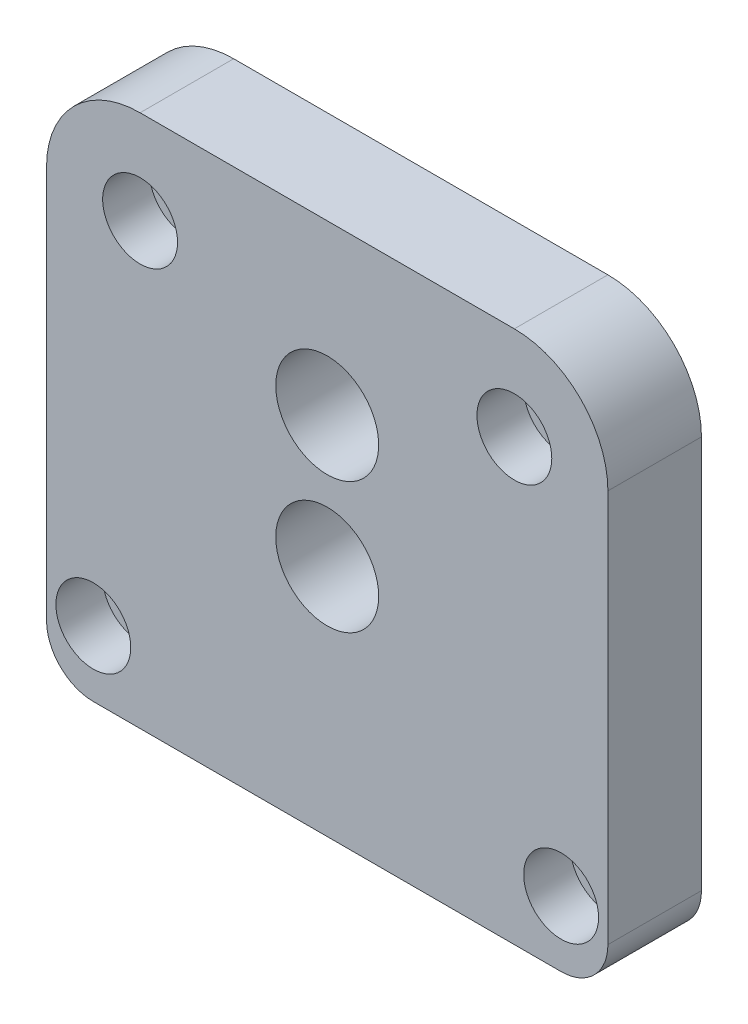
ISO-10303-21;
HEADER;
FILE_DESCRIPTION(('STEP AP214'),'2;1');
FILE_NAME('part.step','',(''),(''),'','','');
FILE_SCHEMA(('AUTOMOTIVE_DESIGN { 1 0 10303 214 1 1 1 1 }'));
ENDSEC;
DATA;
#1=APPLICATION_CONTEXT('core data for automotive mechanical design processes');
#2=APPLICATION_PROTOCOL_DEFINITION('international standard','automotive_design',2000,#1);
#3=PRODUCT_CONTEXT('',#1,'mechanical');
#4=PRODUCT('Part','Part','',(#3));
#5=PRODUCT_RELATED_PRODUCT_CATEGORY('part','',(#4));
#6=PRODUCT_DEFINITION_FORMATION('','',#4);
#7=PRODUCT_DEFINITION_CONTEXT('part definition',#1,'design');
#8=PRODUCT_DEFINITION('design','',#6,#7);
#9=PRODUCT_DEFINITION_SHAPE('','',#8);
#10=(LENGTH_UNIT() NAMED_UNIT(*) SI_UNIT(.MILLI.,.METRE.));
#11=(NAMED_UNIT(*) PLANE_ANGLE_UNIT() SI_UNIT($,.RADIAN.));
#12=(NAMED_UNIT(*) SI_UNIT($,.STERADIAN.) SOLID_ANGLE_UNIT());
#13=UNCERTAINTY_MEASURE_WITH_UNIT(LENGTH_MEASURE(1.E-05),#10,'distance_accuracy_value','');
#14=(GEOMETRIC_REPRESENTATION_CONTEXT(3) GLOBAL_UNCERTAINTY_ASSIGNED_CONTEXT((#13)) GLOBAL_UNIT_ASSIGNED_CONTEXT((#10,
#11,#12)) REPRESENTATION_CONTEXT('',''));
#15=CARTESIAN_POINT('',(0.,0.,0.));
#16=DIRECTION('',(0.,0.,1.));
#17=DIRECTION('',(1.,0.,0.));
#18=AXIS2_PLACEMENT_3D('',#15,#16,#17);
#19=CARTESIAN_POINT('',(0.,0.,0.));
#20=DIRECTION('',(0.,0.,-1.));
#21=DIRECTION('',(-1.,0.,0.));
#22=AXIS2_PLACEMENT_3D('',#19,#20,#21);
#23=PLANE('',#22);
#24=CARTESIAN_POINT('',(-24.9999999999984,-18.,0.));
#25=DIRECTION('',(0.,0.,-1.));
#26=DIRECTION('',(-1.,0.,0.));
#27=AXIS2_PLACEMENT_3D('',#24,#25,#26);
#28=CIRCLE('',#27,1.60000000000141);
#29=CARTESIAN_POINT('',(-26.5999999999998,-18.,0.));
#30=VERTEX_POINT('',#29);
#31=EDGE_CURVE('E196',#30,#30,#28,.T.);
#32=ORIENTED_EDGE('',*,*,#31,.F.);
#33=EDGE_LOOP('',(#32));
#34=FACE_BOUND('',#33,.T.);
#35=CARTESIAN_POINT('',(-19.9999999999986,22.0000000000002,0.));
#36=DIRECTION('',(0.,0.,-1.));
#37=DIRECTION('',(-1.,0.,0.));
#38=AXIS2_PLACEMENT_3D('',#35,#36,#37);
#39=CIRCLE('',#38,1.6000000000014);
#40=CARTESIAN_POINT('',(-21.6,22.0000000000002,0.));
#41=VERTEX_POINT('',#40);
#42=EDGE_CURVE('E201',#41,#41,#39,.T.);
#43=ORIENTED_EDGE('',*,*,#42,.F.);
#44=EDGE_LOOP('',(#43));
#45=FACE_BOUND('',#44,.T.);
#46=CARTESIAN_POINT('',(25.0000000000016,-17.9999999999997,0.));
#47=DIRECTION('',(0.,0.,-1.));
#48=DIRECTION('',(-1.,0.,0.));
#49=AXIS2_PLACEMENT_3D('',#46,#47,#48);
#50=CIRCLE('',#49,1.6000000000014);
#51=CARTESIAN_POINT('',(23.4000000000002,-17.9999999999997,0.));
#52=VERTEX_POINT('',#51);
#53=EDGE_CURVE('E197',#52,#52,#50,.T.);
#54=ORIENTED_EDGE('',*,*,#53,.F.);
#55=EDGE_LOOP('',(#54));
#56=FACE_BOUND('',#55,.T.);
#57=CARTESIAN_POINT('',(20.0000000000015,22.0000000000005,0.));
#58=DIRECTION('',(0.,0.,-1.));
#59=DIRECTION('',(-1.,0.,0.));
#60=AXIS2_PLACEMENT_3D('',#57,#58,#59);
#61=CIRCLE('',#60,1.60000000000141);
#62=CARTESIAN_POINT('',(18.4000000000001,22.0000000000005,0.));
#63=VERTEX_POINT('',#62);
#64=EDGE_CURVE('E200',#63,#63,#61,.T.);
#65=ORIENTED_EDGE('',*,*,#64,.F.);
#66=EDGE_LOOP('',(#65));
#67=FACE_BOUND('',#66,.T.);
#68=DIRECTION('',(0.,1.,0.));
#69=VECTOR('',#68,1.);
#70=CARTESIAN_POINT('',(30.,-25.,0.));
#71=LINE('',#70,#69);
#72=CARTESIAN_POINT('',(30.,-20.,0.));
#73=VERTEX_POINT('',#72);
#74=CARTESIAN_POINT('',(30.,22.,0.));
#75=VERTEX_POINT('',#74);
#76=EDGE_CURVE('E221',#73,#75,#71,.T.);
#77=ORIENTED_EDGE('',*,*,#76,.F.);
#78=CARTESIAN_POINT('',(25.,-20.,0.));
#79=DIRECTION('',(0.,0.,-1.));
#80=DIRECTION('',(-1.,0.,0.));
#81=AXIS2_PLACEMENT_3D('',#78,#79,#80);
#82=CIRCLE('',#81,5.);
#83=CARTESIAN_POINT('',(25.,-25.,0.));
#84=VERTEX_POINT('',#83);
#85=EDGE_CURVE('E271',#73,#84,#82,.T.);
#86=ORIENTED_EDGE('',*,*,#85,.T.);
#87=DIRECTION('',(1.,0.,0.));
#88=VECTOR('',#87,1.);
#89=CARTESIAN_POINT('',(-30.,-25.,0.));
#90=LINE('',#89,#88);
#91=CARTESIAN_POINT('',(-25.,-25.,0.));
#92=VERTEX_POINT('',#91);
#93=EDGE_CURVE('E226',#92,#84,#90,.T.);
#94=ORIENTED_EDGE('',*,*,#93,.F.);
#95=CARTESIAN_POINT('',(-25.,-20.,0.));
#96=DIRECTION('',(0.,0.,-1.));
#97=DIRECTION('',(-1.,0.,0.));
#98=AXIS2_PLACEMENT_3D('',#95,#96,#97);
#99=CIRCLE('',#98,5.);
#100=CARTESIAN_POINT('',(-30.,-20.,0.));
#101=VERTEX_POINT('',#100);
#102=EDGE_CURVE('E262',#92,#101,#99,.T.);
#103=ORIENTED_EDGE('',*,*,#102,.T.);
#104=DIRECTION('',(0.,-1.,0.));
#105=VECTOR('',#104,1.);
#106=CARTESIAN_POINT('',(-30.,-25.,0.));
#107=LINE('',#106,#105);
#108=CARTESIAN_POINT('',(-30.,22.,0.));
#109=VERTEX_POINT('',#108);
#110=EDGE_CURVE('E223',#109,#101,#107,.T.);
#111=ORIENTED_EDGE('',*,*,#110,.F.);
#112=CARTESIAN_POINT('',(-20.,22.,0.));
#113=DIRECTION('',(0.,0.,-1.));
#114=DIRECTION('',(-1.,0.,0.));
#115=AXIS2_PLACEMENT_3D('',#112,#113,#114);
#116=CIRCLE('',#115,10.);
#117=CARTESIAN_POINT('',(-20.,32.,0.));
#118=VERTEX_POINT('',#117);
#119=EDGE_CURVE('E235',#109,#118,#116,.T.);
#120=ORIENTED_EDGE('',*,*,#119,.T.);
#121=DIRECTION('',(-1.,0.,0.));
#122=VECTOR('',#121,1.);
#123=CARTESIAN_POINT('',(-30.,32.,0.));
#124=LINE('',#123,#122);
#125=CARTESIAN_POINT('',(20.,32.,0.));
#126=VERTEX_POINT('',#125);
#127=EDGE_CURVE('E193',#126,#118,#124,.T.);
#128=ORIENTED_EDGE('',*,*,#127,.F.);
#129=CARTESIAN_POINT('',(20.,22.,0.));
#130=DIRECTION('',(0.,0.,-1.));
#131=DIRECTION('',(-1.,0.,0.));
#132=AXIS2_PLACEMENT_3D('',#129,#130,#131);
#133=CIRCLE('',#132,10.);
#134=EDGE_CURVE('E251',#126,#75,#133,.T.);
#135=ORIENTED_EDGE('',*,*,#134,.T.);
#136=EDGE_LOOP('',(#77,#86,#94,#103,#111,#120,#128,#135));
#137=FACE_BOUND('',#136,.T.);
#138=CARTESIAN_POINT('',(0.,14.,0.));
#139=DIRECTION('',(0.,0.,-1.));
#140=DIRECTION('',(-1.,0.,0.));
#141=AXIS2_PLACEMENT_3D('',#138,#139,#140);
#142=CIRCLE('',#141,15.);
#143=CARTESIAN_POINT('',(-15.,14.,0.));
#144=VERTEX_POINT('',#143);
#145=CARTESIAN_POINT('',(15.,14.,0.));
#146=VERTEX_POINT('',#145);
#147=EDGE_CURVE('E648',#144,#146,#142,.T.);
#148=ORIENTED_EDGE('',*,*,#147,.F.);
#149=DIRECTION('',(0.,-1.,0.));
#150=VECTOR('',#149,1.);
#151=CARTESIAN_POINT('',(-15.,0.,0.));
#152=LINE('',#151,#150);
#153=CARTESIAN_POINT('',(-15.,0.,0.));
#154=VERTEX_POINT('',#153);
#155=EDGE_CURVE('E154',#144,#154,#152,.T.);
#156=ORIENTED_EDGE('',*,*,#155,.T.);
#157=CARTESIAN_POINT('',(0.,0.,0.));
#158=DIRECTION('',(0.,0.,1.));
#159=DIRECTION('',(1.,0.,0.));
#160=AXIS2_PLACEMENT_3D('',#157,#158,#159);
#161=CIRCLE('',#160,15.);
#162=CARTESIAN_POINT('',(15.,0.,0.));
#163=VERTEX_POINT('',#162);
#164=EDGE_CURVE('E218',#154,#163,#161,.T.);
#165=ORIENTED_EDGE('',*,*,#164,.T.);
#166=DIRECTION('',(0.,-1.,0.));
#167=VECTOR('',#166,1.);
#168=CARTESIAN_POINT('',(15.,0.,0.));
#169=LINE('',#168,#167);
#170=EDGE_CURVE('E649',#146,#163,#169,.T.);
#171=ORIENTED_EDGE('',*,*,#170,.F.);
#172=EDGE_LOOP('',(#148,#156,#165,#171));
#173=FACE_BOUND('',#172,.T.);
#174=ADVANCED_FACE('F47',(#34,#45,#56,#67,#137,#173),#23,.T.);
#175=CARTESIAN_POINT('',(20.0000000000015,22.0000000000005,10.));
#176=DIRECTION('',(0.,0.,-1.));
#177=DIRECTION('',(-1.,0.,0.));
#178=AXIS2_PLACEMENT_3D('',#175,#176,#177);
#179=CYLINDRICAL_SURFACE('',#178,1.60000000000141);
#180=ORIENTED_EDGE('',*,*,#64,.T.);
#181=EDGE_LOOP('',(#180));
#182=FACE_BOUND('',#181,.T.);
#183=CARTESIAN_POINT('',(20.0000000000015,22.0000000000005,5.));
#184=DIRECTION('',(0.,0.,1.));
#185=DIRECTION('',(1.,0.,0.));
#186=AXIS2_PLACEMENT_3D('',#183,#184,#185);
#187=CIRCLE('',#186,1.60000000000141);
#188=CARTESIAN_POINT('',(21.6000000000029,22.0000000000005,5.));
#189=VERTEX_POINT('',#188);
#190=EDGE_CURVE('E194',#189,#189,#187,.F.);
#191=ORIENTED_EDGE('',*,*,#190,.F.);
#192=EDGE_LOOP('',(#191));
#193=FACE_BOUND('',#192,.T.);
#194=ADVANCED_FACE('F319',(#182,#193),#179,.F.);
#195=CARTESIAN_POINT('',(25.0000000000016,-17.9999999999997,10.));
#196=DIRECTION('',(0.,0.,-1.));
#197=DIRECTION('',(-1.,0.,0.));
#198=AXIS2_PLACEMENT_3D('',#195,#196,#197);
#199=CYLINDRICAL_SURFACE('',#198,1.6000000000014);
#200=ORIENTED_EDGE('',*,*,#53,.T.);
#201=EDGE_LOOP('',(#200));
#202=FACE_BOUND('',#201,.T.);
#203=CARTESIAN_POINT('',(25.0000000000016,-17.9999999999997,5.));
#204=DIRECTION('',(0.,0.,1.));
#205=DIRECTION('',(1.,0.,0.));
#206=AXIS2_PLACEMENT_3D('',#203,#204,#205);
#207=CIRCLE('',#206,1.6000000000014);
#208=CARTESIAN_POINT('',(26.600000000003,-17.9999999999997,5.));
#209=VERTEX_POINT('',#208);
#210=EDGE_CURVE('E244',#209,#209,#207,.F.);
#211=ORIENTED_EDGE('',*,*,#210,.F.);
#212=EDGE_LOOP('',(#211));
#213=FACE_BOUND('',#212,.T.);
#214=ADVANCED_FACE('F326',(#202,#213),#199,.F.);
#215=CARTESIAN_POINT('',(-19.9999999999986,22.0000000000002,10.));
#216=DIRECTION('',(0.,0.,-1.));
#217=DIRECTION('',(-1.,0.,0.));
#218=AXIS2_PLACEMENT_3D('',#215,#216,#217);
#219=CYLINDRICAL_SURFACE('',#218,1.6000000000014);
#220=ORIENTED_EDGE('',*,*,#42,.T.);
#221=EDGE_LOOP('',(#220));
#222=FACE_BOUND('',#221,.T.);
#223=CARTESIAN_POINT('',(-19.9999999999986,22.0000000000002,5.));
#224=DIRECTION('',(0.,0.,1.));
#225=DIRECTION('',(1.,0.,0.));
#226=AXIS2_PLACEMENT_3D('',#223,#224,#225);
#227=CIRCLE('',#226,1.6000000000014);
#228=CARTESIAN_POINT('',(-18.3999999999972,22.0000000000002,5.));
#229=VERTEX_POINT('',#228);
#230=EDGE_CURVE('E241',#229,#229,#227,.F.);
#231=ORIENTED_EDGE('',*,*,#230,.F.);
#232=EDGE_LOOP('',(#231));
#233=FACE_BOUND('',#232,.T.);
#234=ADVANCED_FACE('F363',(#222,#233),#219,.F.);
#235=CARTESIAN_POINT('',(-24.9999999999984,-18.,10.));
#236=DIRECTION('',(0.,0.,-1.));
#237=DIRECTION('',(-1.,0.,0.));
#238=AXIS2_PLACEMENT_3D('',#235,#236,#237);
#239=CYLINDRICAL_SURFACE('',#238,1.60000000000141);
#240=ORIENTED_EDGE('',*,*,#31,.T.);
#241=EDGE_LOOP('',(#240));
#242=FACE_BOUND('',#241,.T.);
#243=CARTESIAN_POINT('',(-24.9999999999984,-18.,5.));
#244=DIRECTION('',(0.,0.,1.));
#245=DIRECTION('',(1.,0.,0.));
#246=AXIS2_PLACEMENT_3D('',#243,#244,#245);
#247=CIRCLE('',#246,1.60000000000141);
#248=CARTESIAN_POINT('',(-23.399999999997,-18.,5.));
#249=VERTEX_POINT('',#248);
#250=EDGE_CURVE('E187',#249,#249,#247,.F.);
#251=ORIENTED_EDGE('',*,*,#250,.F.);
#252=EDGE_LOOP('',(#251));
#253=FACE_BOUND('',#252,.T.);
#254=ADVANCED_FACE('F339',(#242,#253),#239,.F.);
#255=CARTESIAN_POINT('',(30.,-25.,5.));
#256=DIRECTION('',(-1.,0.,0.));
#257=DIRECTION('',(0.,0.,1.));
#258=AXIS2_PLACEMENT_3D('',#255,#256,#257);
#259=PLANE('',#258);
#260=DIRECTION('',(0.,1.,0.));
#261=VECTOR('',#260,1.);
#262=CARTESIAN_POINT('',(30.,-25.,10.));
#263=LINE('',#262,#261);
#264=CARTESIAN_POINT('',(30.,-20.,10.));
#265=VERTEX_POINT('',#264);
#266=CARTESIAN_POINT('',(30.,22.,10.));
#267=VERTEX_POINT('',#266);
#268=EDGE_CURVE('E211',#265,#267,#263,.T.);
#269=ORIENTED_EDGE('',*,*,#268,.F.);
#270=DIRECTION('',(0.,0.,-1.));
#271=VECTOR('',#270,1.);
#272=CARTESIAN_POINT('',(30.,-20.,5.));
#273=LINE('',#272,#271);
#274=EDGE_CURVE('E268',#265,#73,#273,.T.);
#275=ORIENTED_EDGE('',*,*,#274,.T.);
#276=ORIENTED_EDGE('',*,*,#76,.T.);
#277=DIRECTION('',(0.,0.,-1.));
#278=VECTOR('',#277,1.);
#279=CARTESIAN_POINT('',(30.,22.,5.));
#280=LINE('',#279,#278);
#281=EDGE_CURVE('E254',#75,#267,#280,.F.);
#282=ORIENTED_EDGE('',*,*,#281,.T.);
#283=EDGE_LOOP('',(#269,#275,#276,#282));
#284=FACE_BOUND('',#283,.T.);
#285=ADVANCED_FACE('F286',(#284),#259,.F.);
#286=CARTESIAN_POINT('',(-30.,-25.,5.));
#287=DIRECTION('',(1.,0.,0.));
#288=DIRECTION('',(0.,0.,-1.));
#289=AXIS2_PLACEMENT_3D('',#286,#287,#288);
#290=PLANE('',#289);
#291=ORIENTED_EDGE('',*,*,#110,.T.);
#292=DIRECTION('',(0.,0.,-1.));
#293=VECTOR('',#292,1.);
#294=CARTESIAN_POINT('',(-30.,-20.,5.));
#295=LINE('',#294,#293);
#296=CARTESIAN_POINT('',(-30.,-20.,10.));
#297=VERTEX_POINT('',#296);
#298=EDGE_CURVE('E264',#101,#297,#295,.F.);
#299=ORIENTED_EDGE('',*,*,#298,.T.);
#300=DIRECTION('',(0.,-1.,0.));
#301=VECTOR('',#300,1.);
#302=CARTESIAN_POINT('',(-30.,-25.,10.));
#303=LINE('',#302,#301);
#304=CARTESIAN_POINT('',(-30.,22.,10.));
#305=VERTEX_POINT('',#304);
#306=EDGE_CURVE('E213',#305,#297,#303,.T.);
#307=ORIENTED_EDGE('',*,*,#306,.F.);
#308=DIRECTION('',(0.,0.,1.));
#309=VECTOR('',#308,1.);
#310=CARTESIAN_POINT('',(-30.,22.,5.));
#311=LINE('',#310,#309);
#312=EDGE_CURVE('E233',#305,#109,#311,.F.);
#313=ORIENTED_EDGE('',*,*,#312,.T.);
#314=EDGE_LOOP('',(#291,#299,#307,#313));
#315=FACE_BOUND('',#314,.T.);
#316=ADVANCED_FACE('F304',(#315),#290,.F.);
#317=CARTESIAN_POINT('',(-30.,-25.,5.));
#318=DIRECTION('',(0.,1.,0.));
#319=DIRECTION('',(0.,0.,1.));
#320=AXIS2_PLACEMENT_3D('',#317,#318,#319);
#321=PLANE('',#320);
#322=ORIENTED_EDGE('',*,*,#93,.T.);
#323=DIRECTION('',(0.,0.,-1.));
#324=VECTOR('',#323,1.);
#325=CARTESIAN_POINT('',(25.,-25.,5.));
#326=LINE('',#325,#324);
#327=CARTESIAN_POINT('',(25.,-25.,10.));
#328=VERTEX_POINT('',#327);
#329=EDGE_CURVE('E55',#84,#328,#326,.F.);
#330=ORIENTED_EDGE('',*,*,#329,.T.);
#331=DIRECTION('',(1.,0.,0.));
#332=VECTOR('',#331,1.);
#333=CARTESIAN_POINT('',(-30.,-25.,10.));
#334=LINE('',#333,#332);
#335=CARTESIAN_POINT('',(-25.,-25.,10.));
#336=VERTEX_POINT('',#335);
#337=EDGE_CURVE('E216',#336,#328,#334,.T.);
#338=ORIENTED_EDGE('',*,*,#337,.F.);
#339=DIRECTION('',(0.,0.,-1.));
#340=VECTOR('',#339,1.);
#341=CARTESIAN_POINT('',(-25.,-25.,5.));
#342=LINE('',#341,#340);
#343=EDGE_CURVE('E259',#336,#92,#342,.T.);
#344=ORIENTED_EDGE('',*,*,#343,.T.);
#345=EDGE_LOOP('',(#322,#330,#338,#344));
#346=FACE_BOUND('',#345,.T.);
#347=ADVANCED_FACE('F278',(#346),#321,.F.);
#348=CARTESIAN_POINT('',(0.,0.,5.));
#349=DIRECTION('',(0.,0.,-1.));
#350=DIRECTION('',(-1.,0.,0.));
#351=AXIS2_PLACEMENT_3D('',#348,#349,#350);
#352=CYLINDRICAL_SURFACE('',#351,15.);
#353=CARTESIAN_POINT('',(0.,0.,2.));
#354=DIRECTION('',(0.,0.,-1.));
#355=DIRECTION('',(-1.,0.,0.));
#356=AXIS2_PLACEMENT_3D('',#353,#354,#355);
#357=CIRCLE('',#356,15.);
#358=CARTESIAN_POINT('',(15.,0.,2.));
#359=VERTEX_POINT('',#358);
#360=CARTESIAN_POINT('',(-15.,0.,2.));
#361=VERTEX_POINT('',#360);
#362=EDGE_CURVE('E138',#359,#361,#357,.T.);
#363=ORIENTED_EDGE('',*,*,#362,.F.);
#364=DIRECTION('',(0.,0.,-1.));
#365=VECTOR('',#364,1.);
#366=CARTESIAN_POINT('',(15.,0.,5.));
#367=LINE('',#366,#365);
#368=EDGE_CURVE('E162',#359,#163,#367,.T.);
#369=ORIENTED_EDGE('',*,*,#368,.T.);
#370=ORIENTED_EDGE('',*,*,#164,.F.);
#371=DIRECTION('',(0.,0.,-1.));
#372=VECTOR('',#371,1.);
#373=CARTESIAN_POINT('',(-15.,0.,5.));
#374=LINE('',#373,#372);
#375=EDGE_CURVE('E157',#361,#154,#374,.T.);
#376=ORIENTED_EDGE('',*,*,#375,.F.);
#377=EDGE_LOOP('',(#363,#369,#370,#376));
#378=FACE_BOUND('',#377,.T.);
#379=ADVANCED_FACE('F333',(#378),#352,.F.);
#380=CARTESIAN_POINT('',(0.,0.,10.));
#381=DIRECTION('',(0.,0.,-1.));
#382=DIRECTION('',(-1.,0.,0.));
#383=AXIS2_PLACEMENT_3D('',#380,#381,#382);
#384=PLANE('',#383);
#385=CARTESIAN_POINT('',(0.,14.,10.));
#386=DIRECTION('',(0.,0.,-1.));
#387=DIRECTION('',(-1.,0.,0.));
#388=AXIS2_PLACEMENT_3D('',#385,#386,#387);
#389=CIRCLE('',#388,5.5);
#390=CARTESIAN_POINT('',(-5.5,14.,10.));
#391=VERTEX_POINT('',#390);
#392=EDGE_CURVE('E378',#391,#391,#389,.T.);
#393=ORIENTED_EDGE('',*,*,#392,.T.);
#394=EDGE_LOOP('',(#393));
#395=FACE_BOUND('',#394,.T.);
#396=CARTESIAN_POINT('',(20.0000000000015,22.0000000000005,10.));
#397=DIRECTION('',(0.,0.,1.));
#398=DIRECTION('',(1.,0.,0.));
#399=AXIS2_PLACEMENT_3D('',#396,#397,#398);
#400=CIRCLE('',#399,3.99999999999843);
#401=CARTESIAN_POINT('',(23.9999999999999,22.0000000000005,10.));
#402=VERTEX_POINT('',#401);
#403=EDGE_CURVE('E172',#402,#402,#400,.T.);
#404=ORIENTED_EDGE('',*,*,#403,.F.);
#405=EDGE_LOOP('',(#404));
#406=FACE_BOUND('',#405,.T.);
#407=CARTESIAN_POINT('',(-24.9999999999984,-18.,10.));
#408=DIRECTION('',(0.,0.,1.));
#409=DIRECTION('',(1.,0.,0.));
#410=AXIS2_PLACEMENT_3D('',#407,#408,#409);
#411=CIRCLE('',#410,3.99999999999843);
#412=CARTESIAN_POINT('',(-21.,-18.,10.));
#413=VERTEX_POINT('',#412);
#414=EDGE_CURVE('E179',#413,#413,#411,.T.);
#415=ORIENTED_EDGE('',*,*,#414,.F.);
#416=EDGE_LOOP('',(#415));
#417=FACE_BOUND('',#416,.T.);
#418=CARTESIAN_POINT('',(25.0000000000016,-17.9999999999997,10.));
#419=DIRECTION('',(0.,0.,1.));
#420=DIRECTION('',(1.,0.,0.));
#421=AXIS2_PLACEMENT_3D('',#418,#419,#420);
#422=CIRCLE('',#421,3.99999999999843);
#423=CARTESIAN_POINT('',(29.,-17.9999999999997,10.));
#424=VERTEX_POINT('',#423);
#425=EDGE_CURVE('E160',#424,#424,#422,.T.);
#426=ORIENTED_EDGE('',*,*,#425,.F.);
#427=EDGE_LOOP('',(#426));
#428=FACE_BOUND('',#427,.T.);
#429=CARTESIAN_POINT('',(-19.9999999999986,22.0000000000002,10.));
#430=DIRECTION('',(0.,0.,1.));
#431=DIRECTION('',(1.,0.,0.));
#432=AXIS2_PLACEMENT_3D('',#429,#430,#431);
#433=CIRCLE('',#432,3.99999999999843);
#434=CARTESIAN_POINT('',(-16.0000000000002,22.0000000000002,10.));
#435=VERTEX_POINT('',#434);
#436=EDGE_CURVE('E175',#435,#435,#433,.T.);
#437=ORIENTED_EDGE('',*,*,#436,.F.);
#438=EDGE_LOOP('',(#437));
#439=FACE_BOUND('',#438,.T.);
#440=ORIENTED_EDGE('',*,*,#337,.T.);
#441=CARTESIAN_POINT('',(25.,-20.,10.));
#442=DIRECTION('',(0.,0.,-1.));
#443=DIRECTION('',(-1.,0.,0.));
#444=AXIS2_PLACEMENT_3D('',#441,#442,#443);
#445=CIRCLE('',#444,5.);
#446=EDGE_CURVE('E11',#328,#265,#445,.F.);
#447=ORIENTED_EDGE('',*,*,#446,.T.);
#448=ORIENTED_EDGE('',*,*,#268,.T.);
#449=CARTESIAN_POINT('',(20.,22.,10.));
#450=DIRECTION('',(0.,0.,-1.));
#451=DIRECTION('',(-1.,0.,0.));
#452=AXIS2_PLACEMENT_3D('',#449,#450,#451);
#453=CIRCLE('',#452,10.);
#454=CARTESIAN_POINT('',(20.,32.,10.));
#455=VERTEX_POINT('',#454);
#456=EDGE_CURVE('E257',#267,#455,#453,.F.);
#457=ORIENTED_EDGE('',*,*,#456,.T.);
#458=DIRECTION('',(1.,0.,0.));
#459=VECTOR('',#458,1.);
#460=CARTESIAN_POINT('',(-30.,32.,10.));
#461=LINE('',#460,#459);
#462=CARTESIAN_POINT('',(-20.,32.,10.));
#463=VERTEX_POINT('',#462);
#464=EDGE_CURVE('E190',#463,#455,#461,.T.);
#465=ORIENTED_EDGE('',*,*,#464,.F.);
#466=CARTESIAN_POINT('',(-20.,22.,10.));
#467=DIRECTION('',(0.,0.,-1.));
#468=DIRECTION('',(-1.,0.,0.));
#469=AXIS2_PLACEMENT_3D('',#466,#467,#468);
#470=CIRCLE('',#469,10.);
#471=EDGE_CURVE('E231',#463,#305,#470,.F.);
#472=ORIENTED_EDGE('',*,*,#471,.T.);
#473=ORIENTED_EDGE('',*,*,#306,.T.);
#474=CARTESIAN_POINT('',(-25.,-20.,10.));
#475=DIRECTION('',(0.,0.,-1.));
#476=DIRECTION('',(-1.,0.,0.));
#477=AXIS2_PLACEMENT_3D('',#474,#475,#476);
#478=CIRCLE('',#477,5.);
#479=EDGE_CURVE('E266',#297,#336,#478,.F.);
#480=ORIENTED_EDGE('',*,*,#479,.T.);
#481=EDGE_LOOP('',(#440,#447,#448,#457,#465,#472,#473,#480));
#482=FACE_BOUND('',#481,.T.);
#483=CARTESIAN_POINT('',(0.,0.,10.));
#484=DIRECTION('',(0.,0.,1.));
#485=DIRECTION('',(1.,0.,0.));
#486=AXIS2_PLACEMENT_3D('',#483,#484,#485);
#487=CIRCLE('',#486,5.5);
#488=CARTESIAN_POINT('',(5.5,0.,10.));
#489=VERTEX_POINT('',#488);
#490=EDGE_CURVE('E208',#489,#489,#487,.T.);
#491=ORIENTED_EDGE('',*,*,#490,.F.);
#492=EDGE_LOOP('',(#491));
#493=FACE_BOUND('',#492,.T.);
#494=ADVANCED_FACE('F283',(#395,#406,#417,#428,#439,#482,#493),#384,.F.);
#495=CARTESIAN_POINT('',(0.,0.,10.));
#496=DIRECTION('',(0.,0.,-1.));
#497=DIRECTION('',(-1.,0.,0.));
#498=AXIS2_PLACEMENT_3D('',#495,#496,#497);
#499=CYLINDRICAL_SURFACE('',#498,5.5);
#500=ORIENTED_EDGE('',*,*,#490,.T.);
#501=EDGE_LOOP('',(#500));
#502=FACE_BOUND('',#501,.T.);
#503=CARTESIAN_POINT('',(0.,0.,2.));
#504=DIRECTION('',(0.,0.,-1.));
#505=DIRECTION('',(-1.,0.,0.));
#506=AXIS2_PLACEMENT_3D('',#503,#504,#505);
#507=CIRCLE('',#506,5.5);
#508=CARTESIAN_POINT('',(-5.5,0.,2.));
#509=VERTEX_POINT('',#508);
#510=EDGE_CURVE('E640',#509,#509,#507,.F.);
#511=ORIENTED_EDGE('',*,*,#510,.F.);
#512=EDGE_LOOP('',(#511));
#513=FACE_BOUND('',#512,.T.);
#514=ADVANCED_FACE('F349',(#502,#513),#499,.F.);
#515=CARTESIAN_POINT('',(0.,32.,0.));
#516=DIRECTION('',(0.,-1.,0.));
#517=DIRECTION('',(0.,0.,-1.));
#518=AXIS2_PLACEMENT_3D('',#515,#516,#517);
#519=PLANE('',#518);
#520=ORIENTED_EDGE('',*,*,#464,.T.);
#521=DIRECTION('',(0.,0.,-1.));
#522=VECTOR('',#521,1.);
#523=CARTESIAN_POINT('',(20.,32.,0.));
#524=LINE('',#523,#522);
#525=EDGE_CURVE('E238',#455,#126,#524,.T.);
#526=ORIENTED_EDGE('',*,*,#525,.T.);
#527=ORIENTED_EDGE('',*,*,#127,.T.);
#528=DIRECTION('',(0.,0.,1.));
#529=VECTOR('',#528,1.);
#530=CARTESIAN_POINT('',(-20.,32.,0.));
#531=LINE('',#530,#529);
#532=EDGE_CURVE('E228',#118,#463,#531,.T.);
#533=ORIENTED_EDGE('',*,*,#532,.T.);
#534=EDGE_LOOP('',(#520,#526,#527,#533));
#535=FACE_BOUND('',#534,.T.);
#536=ADVANCED_FACE('F294',(#535),#519,.F.);
#537=CARTESIAN_POINT('',(-20.,22.,0.));
#538=DIRECTION('',(0.,0.,1.));
#539=DIRECTION('',(1.,0.,0.));
#540=AXIS2_PLACEMENT_3D('',#537,#538,#539);
#541=CYLINDRICAL_SURFACE('',#540,10.);
#542=ORIENTED_EDGE('',*,*,#119,.F.);
#543=ORIENTED_EDGE('',*,*,#312,.F.);
#544=ORIENTED_EDGE('',*,*,#471,.F.);
#545=ORIENTED_EDGE('',*,*,#532,.F.);
#546=EDGE_LOOP('',(#542,#543,#544,#545));
#547=FACE_BOUND('',#546,.T.);
#548=ADVANCED_FACE('F299',(#547),#541,.T.);
#549=CARTESIAN_POINT('',(-24.9999999999984,-18.,5.));
#550=DIRECTION('',(0.,0.,1.));
#551=DIRECTION('',(1.,0.,0.));
#552=AXIS2_PLACEMENT_3D('',#549,#550,#551);
#553=PLANE('',#552);
#554=CARTESIAN_POINT('',(-24.9999999999984,-18.,5.));
#555=DIRECTION('',(0.,0.,1.));
#556=DIRECTION('',(1.,0.,0.));
#557=AXIS2_PLACEMENT_3D('',#554,#555,#556);
#558=CIRCLE('',#557,3.99999999999843);
#559=CARTESIAN_POINT('',(-21.,-18.,5.));
#560=VERTEX_POINT('',#559);
#561=EDGE_CURVE('E170',#560,#560,#558,.T.);
#562=ORIENTED_EDGE('',*,*,#561,.T.);
#563=EDGE_LOOP('',(#562));
#564=FACE_BOUND('',#563,.T.);
#565=ORIENTED_EDGE('',*,*,#250,.T.);
#566=EDGE_LOOP('',(#565));
#567=FACE_BOUND('',#566,.T.);
#568=ADVANCED_FACE('F341',(#564,#567),#553,.T.);
#569=CARTESIAN_POINT('',(-24.9999999999984,-18.,5.));
#570=DIRECTION('',(0.,0.,1.));
#571=DIRECTION('',(1.,0.,0.));
#572=AXIS2_PLACEMENT_3D('',#569,#570,#571);
#573=CYLINDRICAL_SURFACE('',#572,3.99999999999843);
#574=ORIENTED_EDGE('',*,*,#561,.F.);
#575=EDGE_LOOP('',(#574));
#576=FACE_BOUND('',#575,.T.);
#577=ORIENTED_EDGE('',*,*,#414,.T.);
#578=EDGE_LOOP('',(#577));
#579=FACE_BOUND('',#578,.T.);
#580=ADVANCED_FACE('F345',(#576,#579),#573,.F.);
#581=CARTESIAN_POINT('',(-19.9999999999986,22.0000000000002,5.));
#582=DIRECTION('',(0.,0.,1.));
#583=DIRECTION('',(1.,0.,0.));
#584=AXIS2_PLACEMENT_3D('',#581,#582,#583);
#585=PLANE('',#584);
#586=CARTESIAN_POINT('',(-19.9999999999986,22.0000000000002,5.));
#587=DIRECTION('',(0.,0.,1.));
#588=DIRECTION('',(1.,0.,0.));
#589=AXIS2_PLACEMENT_3D('',#586,#587,#588);
#590=CIRCLE('',#589,3.99999999999843);
#591=CARTESIAN_POINT('',(-16.0000000000002,22.0000000000002,5.));
#592=VERTEX_POINT('',#591);
#593=EDGE_CURVE('E184',#592,#592,#590,.T.);
#594=ORIENTED_EDGE('',*,*,#593,.T.);
#595=EDGE_LOOP('',(#594));
#596=FACE_BOUND('',#595,.T.);
#597=ORIENTED_EDGE('',*,*,#230,.T.);
#598=EDGE_LOOP('',(#597));
#599=FACE_BOUND('',#598,.T.);
#600=ADVANCED_FACE('F389',(#596,#599),#585,.T.);
#601=CARTESIAN_POINT('',(-19.9999999999986,22.0000000000002,5.));
#602=DIRECTION('',(0.,0.,1.));
#603=DIRECTION('',(1.,0.,0.));
#604=AXIS2_PLACEMENT_3D('',#601,#602,#603);
#605=CYLINDRICAL_SURFACE('',#604,3.99999999999843);
#606=ORIENTED_EDGE('',*,*,#593,.F.);
#607=EDGE_LOOP('',(#606));
#608=FACE_BOUND('',#607,.T.);
#609=ORIENTED_EDGE('',*,*,#436,.T.);
#610=EDGE_LOOP('',(#609));
#611=FACE_BOUND('',#610,.T.);
#612=ADVANCED_FACE('F359',(#608,#611),#605,.F.);
#613=CARTESIAN_POINT('',(25.0000000000016,-17.9999999999997,5.));
#614=DIRECTION('',(0.,0.,1.));
#615=DIRECTION('',(1.,0.,0.));
#616=AXIS2_PLACEMENT_3D('',#613,#614,#615);
#617=PLANE('',#616);
#618=CARTESIAN_POINT('',(25.0000000000016,-17.9999999999997,5.));
#619=DIRECTION('',(0.,0.,1.));
#620=DIRECTION('',(1.,0.,0.));
#621=AXIS2_PLACEMENT_3D('',#618,#619,#620);
#622=CIRCLE('',#621,3.99999999999843);
#623=CARTESIAN_POINT('',(29.,-17.9999999999997,5.));
#624=VERTEX_POINT('',#623);
#625=EDGE_CURVE('E156',#624,#624,#622,.T.);
#626=ORIENTED_EDGE('',*,*,#625,.T.);
#627=EDGE_LOOP('',(#626));
#628=FACE_BOUND('',#627,.T.);
#629=ORIENTED_EDGE('',*,*,#210,.T.);
#630=EDGE_LOOP('',(#629));
#631=FACE_BOUND('',#630,.T.);
#632=ADVANCED_FACE('F388',(#628,#631),#617,.T.);
#633=CARTESIAN_POINT('',(25.0000000000016,-17.9999999999997,5.));
#634=DIRECTION('',(0.,0.,1.));
#635=DIRECTION('',(1.,0.,0.));
#636=AXIS2_PLACEMENT_3D('',#633,#634,#635);
#637=CYLINDRICAL_SURFACE('',#636,3.99999999999843);
#638=ORIENTED_EDGE('',*,*,#625,.F.);
#639=EDGE_LOOP('',(#638));
#640=FACE_BOUND('',#639,.T.);
#641=ORIENTED_EDGE('',*,*,#425,.T.);
#642=EDGE_LOOP('',(#641));
#643=FACE_BOUND('',#642,.T.);
#644=ADVANCED_FACE('F395',(#640,#643),#637,.F.);
#645=CARTESIAN_POINT('',(20.0000000000015,22.0000000000005,5.));
#646=DIRECTION('',(0.,0.,1.));
#647=DIRECTION('',(1.,0.,0.));
#648=AXIS2_PLACEMENT_3D('',#645,#646,#647);
#649=PLANE('',#648);
#650=CARTESIAN_POINT('',(20.0000000000015,22.0000000000005,5.));
#651=DIRECTION('',(0.,0.,1.));
#652=DIRECTION('',(1.,0.,0.));
#653=AXIS2_PLACEMENT_3D('',#650,#651,#652);
#654=CIRCLE('',#653,3.99999999999843);
#655=CARTESIAN_POINT('',(23.9999999999999,22.0000000000005,5.));
#656=VERTEX_POINT('',#655);
#657=EDGE_CURVE('E176',#656,#656,#654,.T.);
#658=ORIENTED_EDGE('',*,*,#657,.T.);
#659=EDGE_LOOP('',(#658));
#660=FACE_BOUND('',#659,.T.);
#661=ORIENTED_EDGE('',*,*,#190,.T.);
#662=EDGE_LOOP('',(#661));
#663=FACE_BOUND('',#662,.T.);
#664=ADVANCED_FACE('F409',(#660,#663),#649,.T.);
#665=CARTESIAN_POINT('',(20.0000000000015,22.0000000000005,5.));
#666=DIRECTION('',(0.,0.,1.));
#667=DIRECTION('',(1.,0.,0.));
#668=AXIS2_PLACEMENT_3D('',#665,#666,#667);
#669=CYLINDRICAL_SURFACE('',#668,3.99999999999843);
#670=ORIENTED_EDGE('',*,*,#657,.F.);
#671=EDGE_LOOP('',(#670));
#672=FACE_BOUND('',#671,.T.);
#673=ORIENTED_EDGE('',*,*,#403,.T.);
#674=EDGE_LOOP('',(#673));
#675=FACE_BOUND('',#674,.T.);
#676=ADVANCED_FACE('F316',(#672,#675),#669,.F.);
#677=CARTESIAN_POINT('',(20.,22.,0.));
#678=DIRECTION('',(0.,0.,-1.));
#679=DIRECTION('',(-1.,0.,0.));
#680=AXIS2_PLACEMENT_3D('',#677,#678,#679);
#681=CYLINDRICAL_SURFACE('',#680,10.);
#682=ORIENTED_EDGE('',*,*,#456,.F.);
#683=ORIENTED_EDGE('',*,*,#281,.F.);
#684=ORIENTED_EDGE('',*,*,#134,.F.);
#685=ORIENTED_EDGE('',*,*,#525,.F.);
#686=EDGE_LOOP('',(#682,#683,#684,#685));
#687=FACE_BOUND('',#686,.T.);
#688=ADVANCED_FACE('F291',(#687),#681,.T.);
#689=CARTESIAN_POINT('',(-25.,-20.,5.));
#690=DIRECTION('',(0.,0.,-1.));
#691=DIRECTION('',(-1.,0.,0.));
#692=AXIS2_PLACEMENT_3D('',#689,#690,#691);
#693=CYLINDRICAL_SURFACE('',#692,5.);
#694=ORIENTED_EDGE('',*,*,#479,.F.);
#695=ORIENTED_EDGE('',*,*,#298,.F.);
#696=ORIENTED_EDGE('',*,*,#102,.F.);
#697=ORIENTED_EDGE('',*,*,#343,.F.);
#698=EDGE_LOOP('',(#694,#695,#696,#697));
#699=FACE_BOUND('',#698,.T.);
#700=ADVANCED_FACE('F308',(#699),#693,.T.);
#701=CARTESIAN_POINT('',(25.,-20.,5.));
#702=DIRECTION('',(0.,0.,-1.));
#703=DIRECTION('',(-1.,0.,0.));
#704=AXIS2_PLACEMENT_3D('',#701,#702,#703);
#705=CYLINDRICAL_SURFACE('',#704,5.);
#706=ORIENTED_EDGE('',*,*,#446,.F.);
#707=ORIENTED_EDGE('',*,*,#329,.F.);
#708=ORIENTED_EDGE('',*,*,#85,.F.);
#709=ORIENTED_EDGE('',*,*,#274,.F.);
#710=EDGE_LOOP('',(#706,#707,#708,#709));
#711=FACE_BOUND('',#710,.T.);
#712=ADVANCED_FACE('F49',(#711),#705,.T.);
#713=CARTESIAN_POINT('',(0.,14.,5.));
#714=DIRECTION('',(0.,0.,-1.));
#715=DIRECTION('',(-1.,0.,0.));
#716=AXIS2_PLACEMENT_3D('',#713,#714,#715);
#717=CYLINDRICAL_SURFACE('',#716,15.);
#718=DIRECTION('',(0.,0.,-1.));
#719=VECTOR('',#718,1.);
#720=CARTESIAN_POINT('',(15.,14.,5.));
#721=LINE('',#720,#719);
#722=CARTESIAN_POINT('',(15.,14.,2.));
#723=VERTEX_POINT('',#722);
#724=EDGE_CURVE('E149',#723,#146,#721,.T.);
#725=ORIENTED_EDGE('',*,*,#724,.F.);
#726=CARTESIAN_POINT('',(0.,14.,2.));
#727=DIRECTION('',(0.,0.,-1.));
#728=DIRECTION('',(-1.,0.,0.));
#729=AXIS2_PLACEMENT_3D('',#726,#727,#728);
#730=CIRCLE('',#729,15.);
#731=CARTESIAN_POINT('',(-15.,14.,2.));
#732=VERTEX_POINT('',#731);
#733=EDGE_CURVE('E62',#732,#723,#730,.T.);
#734=ORIENTED_EDGE('',*,*,#733,.F.);
#735=DIRECTION('',(0.,0.,-1.));
#736=VECTOR('',#735,1.);
#737=CARTESIAN_POINT('',(-15.,14.,5.));
#738=LINE('',#737,#736);
#739=EDGE_CURVE('E147',#732,#144,#738,.T.);
#740=ORIENTED_EDGE('',*,*,#739,.T.);
#741=ORIENTED_EDGE('',*,*,#147,.T.);
#742=EDGE_LOOP('',(#725,#734,#740,#741));
#743=FACE_BOUND('',#742,.T.);
#744=ADVANCED_FACE('F145',(#743),#717,.F.);
#745=CARTESIAN_POINT('',(-15.,0.,5.));
#746=DIRECTION('',(1.,0.,0.));
#747=DIRECTION('',(0.,1.,0.));
#748=AXIS2_PLACEMENT_3D('',#745,#746,#747);
#749=PLANE('',#748);
#750=DIRECTION('',(0.,1.,0.));
#751=VECTOR('',#750,1.);
#752=CARTESIAN_POINT('',(-15.,0.,2.));
#753=LINE('',#752,#751);
#754=EDGE_CURVE('E134',#361,#732,#753,.T.);
#755=ORIENTED_EDGE('',*,*,#754,.F.);
#756=ORIENTED_EDGE('',*,*,#375,.T.);
#757=ORIENTED_EDGE('',*,*,#155,.F.);
#758=ORIENTED_EDGE('',*,*,#739,.F.);
#759=EDGE_LOOP('',(#755,#756,#757,#758));
#760=FACE_BOUND('',#759,.T.);
#761=ADVANCED_FACE('F152',(#760),#749,.T.);
#762=CARTESIAN_POINT('',(15.,0.,5.));
#763=DIRECTION('',(1.,0.,0.));
#764=DIRECTION('',(0.,1.,0.));
#765=AXIS2_PLACEMENT_3D('',#762,#763,#764);
#766=PLANE('',#765);
#767=ORIENTED_EDGE('',*,*,#368,.F.);
#768=DIRECTION('',(0.,-1.,0.));
#769=VECTOR('',#768,1.);
#770=CARTESIAN_POINT('',(15.,0.,2.));
#771=LINE('',#770,#769);
#772=EDGE_CURVE('E150',#723,#359,#771,.T.);
#773=ORIENTED_EDGE('',*,*,#772,.F.);
#774=ORIENTED_EDGE('',*,*,#724,.T.);
#775=ORIENTED_EDGE('',*,*,#170,.T.);
#776=EDGE_LOOP('',(#767,#773,#774,#775));
#777=FACE_BOUND('',#776,.T.);
#778=ADVANCED_FACE('F420',(#777),#766,.F.);
#779=CARTESIAN_POINT('',(0.,14.,10.));
#780=DIRECTION('',(0.,0.,-1.));
#781=DIRECTION('',(-1.,0.,0.));
#782=AXIS2_PLACEMENT_3D('',#779,#780,#781);
#783=CYLINDRICAL_SURFACE('',#782,5.5);
#784=ORIENTED_EDGE('',*,*,#392,.F.);
#785=EDGE_LOOP('',(#784));
#786=FACE_BOUND('',#785,.T.);
#787=CARTESIAN_POINT('',(0.,14.,2.));
#788=DIRECTION('',(0.,0.,-1.));
#789=DIRECTION('',(-1.,0.,0.));
#790=AXIS2_PLACEMENT_3D('',#787,#788,#789);
#791=CIRCLE('',#790,5.5);
#792=CARTESIAN_POINT('',(-5.5,14.,2.));
#793=VERTEX_POINT('',#792);
#794=EDGE_CURVE('E639',#793,#793,#791,.F.);
#795=ORIENTED_EDGE('',*,*,#794,.F.);
#796=EDGE_LOOP('',(#795));
#797=FACE_BOUND('',#796,.T.);
#798=ADVANCED_FACE('F423',(#786,#797),#783,.F.);
#799=CARTESIAN_POINT('',(0.,0.,2.));
#800=DIRECTION('',(0.,0.,-1.));
#801=DIRECTION('',(-1.,0.,0.));
#802=AXIS2_PLACEMENT_3D('',#799,#800,#801);
#803=PLANE('',#802);
#804=ORIENTED_EDGE('',*,*,#754,.T.);
#805=ORIENTED_EDGE('',*,*,#733,.T.);
#806=ORIENTED_EDGE('',*,*,#772,.T.);
#807=ORIENTED_EDGE('',*,*,#362,.T.);
#808=EDGE_LOOP('',(#804,#805,#806,#807));
#809=FACE_BOUND('',#808,.T.);
#810=ORIENTED_EDGE('',*,*,#794,.T.);
#811=EDGE_LOOP('',(#810));
#812=FACE_BOUND('',#811,.T.);
#813=ORIENTED_EDGE('',*,*,#510,.T.);
#814=EDGE_LOOP('',(#813));
#815=FACE_BOUND('',#814,.T.);
#816=ADVANCED_FACE('F135',(#809,#812,#815),#803,.T.);
#817=CLOSED_SHELL('',(#174,#194,#214,#234,#254,#285,#316,#347,#379,#494,#514,#536,#548,#568,
#580,#600,#612,#632,#644,#664,#676,#688,#700,#712,#744,#761,#778,#798,#816));
#818=MANIFOLD_SOLID_BREP('B2',#817);
#819=ADVANCED_BREP_SHAPE_REPRESENTATION('',(#18,#818),#14);
#820=SHAPE_DEFINITION_REPRESENTATION(#9,#819);
ENDSEC;
END-ISO-10303-21;
